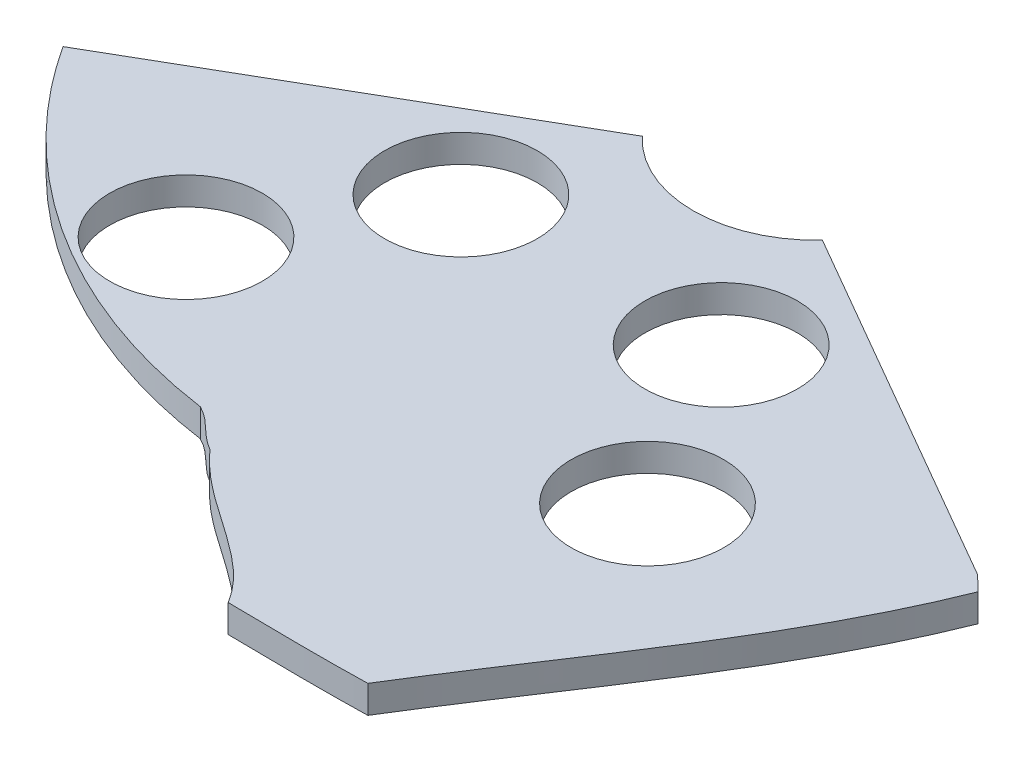
ISO-10303-21;
HEADER;
FILE_DESCRIPTION(('STEP AP214'),'2;1');
FILE_NAME('part.step','',(''),(''),'','','');
FILE_SCHEMA(('AUTOMOTIVE_DESIGN { 1 0 10303 214 1 1 1 1 }'));
ENDSEC;
DATA;
#1=APPLICATION_CONTEXT('core data for automotive mechanical design processes');
#2=APPLICATION_PROTOCOL_DEFINITION('international standard','automotive_design',2000,#1);
#3=PRODUCT_CONTEXT('',#1,'mechanical');
#4=PRODUCT('Part','Part','',(#3));
#5=PRODUCT_RELATED_PRODUCT_CATEGORY('part','',(#4));
#6=PRODUCT_DEFINITION_FORMATION('','',#4);
#7=PRODUCT_DEFINITION_CONTEXT('part definition',#1,'design');
#8=PRODUCT_DEFINITION('design','',#6,#7);
#9=PRODUCT_DEFINITION_SHAPE('','',#8);
#10=(LENGTH_UNIT() NAMED_UNIT(*) SI_UNIT(.MILLI.,.METRE.));
#11=(NAMED_UNIT(*) PLANE_ANGLE_UNIT() SI_UNIT($,.RADIAN.));
#12=(NAMED_UNIT(*) SI_UNIT($,.STERADIAN.) SOLID_ANGLE_UNIT());
#13=UNCERTAINTY_MEASURE_WITH_UNIT(LENGTH_MEASURE(1.E-05),#10,'distance_accuracy_value','');
#14=(GEOMETRIC_REPRESENTATION_CONTEXT(3) GLOBAL_UNCERTAINTY_ASSIGNED_CONTEXT((#13)) GLOBAL_UNIT_ASSIGNED_CONTEXT((#10,
#11,#12)) REPRESENTATION_CONTEXT('',''));
#15=CARTESIAN_POINT('',(0.,0.,0.));
#16=DIRECTION('',(0.,0.,1.));
#17=DIRECTION('',(1.,0.,0.));
#18=AXIS2_PLACEMENT_3D('',#15,#16,#17);
#19=CARTESIAN_POINT('',(-42.2829416875087,-63.7359999999999,66.1392837787392));
#20=DIRECTION('',(0.,-1.,0.));
#21=DIRECTION('',(0.,0.,-1.));
#22=AXIS2_PLACEMENT_3D('',#19,#20,#21);
#23=PLANE('',#22);
#24=CARTESIAN_POINT('',(18.75,-63.7359999999999,32.476));
#25=DIRECTION('',(0.,-1.,0.));
#26=DIRECTION('',(0.,0.,-1.));
#27=AXIS2_PLACEMENT_3D('',#24,#25,#26);
#28=CIRCLE('',#27,10.999845998306);
#29=CARTESIAN_POINT('',(18.75,-63.7359999999999,21.476154001694));
#30=VERTEX_POINT('',#29);
#31=EDGE_CURVE('E447',#30,#30,#28,.T.);
#32=ORIENTED_EDGE('',*,*,#31,.F.);
#33=EDGE_LOOP('',(#32));
#34=FACE_BOUND('',#33,.T.);
#35=CARTESIAN_POINT('',(-33.25,-63.7359999999999,57.591));
#36=DIRECTION('',(0.,-1.,0.));
#37=DIRECTION('',(0.,0.,-1.));
#38=AXIS2_PLACEMENT_3D('',#35,#36,#37);
#39=CIRCLE('',#38,10.999845998306);
#40=CARTESIAN_POINT('',(-33.25,-63.7359999999999,46.591154001694));
#41=VERTEX_POINT('',#40);
#42=EDGE_CURVE('E302',#41,#41,#39,.T.);
#43=ORIENTED_EDGE('',*,*,#42,.F.);
#44=EDGE_LOOP('',(#43));
#45=FACE_BOUND('',#44,.T.);
#46=CARTESIAN_POINT('',(-65.8942438215736,-63.7359999999999,42.6629141284689));
#47=CARTESIAN_POINT('',(-64.3740048179713,-63.7359999999999,45.0101337964769));
#48=CARTESIAN_POINT('',(-62.7293879267321,-63.7359999999999,47.2771326027146));
#49=CARTESIAN_POINT('',(-59.2082837714852,-63.7359999999999,51.6187172670186));
#50=CARTESIAN_POINT('',(-57.3302026715458,-63.7359999999999,53.6960570543909));
#51=CARTESIAN_POINT('',(-51.381584771103,-63.7359999999999,59.610638433358));
#52=CARTESIAN_POINT('',(-46.9944312695531,-63.7359999999999,63.1270068131331));
#53=CARTESIAN_POINT('',(-39.9271968964865,-63.7359999999999,67.6454222615422));
#54=CARTESIAN_POINT('',(-37.4916252366814,-63.7359999999999,69.0254847346516));
#55=CARTESIAN_POINT('',(-32.4863725547856,-63.7359999999999,71.5169507605835));
#56=CARTESIAN_POINT('',(-29.9155606858525,-63.7359999999999,72.6298302490515));
#57=CARTESIAN_POINT('',(-22.0525065809193,-63.7359999999999,75.5468810200134));
#58=CARTESIAN_POINT('',(-16.6005816491119,-63.7359999999999,76.9277313353586));
#59=CARTESIAN_POINT('',(-11.065103995336,-63.7359999999999,77.7159208735888));
#60=B_SPLINE_CURVE_WITH_KNOTS('',3,(#46,#47,#48,#49,#50,#51,#52,#53,#54,#55,#56,#57,#58,#59),
.UNSPECIFIED.,.F.,.F.,(4,2,2,2,2,2,4),(1.36573139508656E-06,0.125001365731395,0.250001365731395,
0.500001365731395,0.625001365731395,0.750001365731395,1.),.UNSPECIFIED.);
#61=CARTESIAN_POINT('',(-11.0651039947963,-63.7359999999999,77.7159208697998));
#62=VERTEX_POINT('',#61);
#63=CARTESIAN_POINT('',(-65.8942438215736,-63.7359999999999,42.6629141284689));
#64=VERTEX_POINT('',#63);
#65=EDGE_CURVE('E262',#62,#64,#60,.F.);
#66=ORIENTED_EDGE('',*,*,#65,.T.);
#67=DIRECTION('',(0.866025113443951,0.,-0.500000502884139));
#68=VECTOR('',#67,1.);
#69=CARTESIAN_POINT('',(-65.8942438215736,-63.7359999999999,42.6629141284689));
#70=LINE('',#69,#68);
#71=CARTESIAN_POINT('',(-12.9766531358799,-63.7359999999999,12.1108879302399));
#72=VERTEX_POINT('',#71);
#73=EDGE_CURVE('E105',#64,#72,#70,.T.);
#74=ORIENTED_EDGE('',*,*,#73,.T.);
#75=CARTESIAN_POINT('',(0.,-63.7359999999999,0.));
#76=DIRECTION('',(0.,1.,0.));
#77=DIRECTION('',(0.,0.,-1.));
#78=AXIS2_PLACEMENT_3D('',#75,#76,#77);
#79=CIRCLE('',#78,17.7501305084715);
#80=CARTESIAN_POINT('',(12.9766531358511,-63.7359999999999,12.1108879302707));
#81=VERTEX_POINT('',#80);
#82=EDGE_CURVE('E272',#72,#81,#79,.T.);
#83=ORIENTED_EDGE('',*,*,#82,.T.);
#84=DIRECTION('',(0.866025113442762,0.,0.500000502886197));
#85=VECTOR('',#84,1.);
#86=CARTESIAN_POINT('',(12.9766531358511,-63.7359999999999,12.1108879302707));
#87=LINE('',#86,#85);
#88=CARTESIAN_POINT('',(65.8946490574716,-63.7359999999999,42.6631480920527));
#89=VERTEX_POINT('',#88);
#90=EDGE_CURVE('E205',#81,#89,#87,.T.);
#91=ORIENTED_EDGE('',*,*,#90,.T.);
#92=CARTESIAN_POINT('',(65.8946490574716,-63.7359999999999,42.6631480920527));
#93=CARTESIAN_POINT('',(66.6334334765272,-63.7359999999999,43.3830753385999));
#94=CARTESIAN_POINT('',(67.3568134463881,-63.7359999999999,44.0873401028635));
#95=CARTESIAN_POINT('',(68.063045438667,-63.7359999999999,44.7780327601671));
#96=B_SPLINE_CURVE_WITH_KNOTS('',3,(#92,#93,#94,#95),.UNSPECIFIED.,.F.,.F.,(4,4),(0.,1.),.UNSPECIFIED.);
#97=CARTESIAN_POINT('',(68.0628306155719,-63.7359999999999,44.7778226639574));
#98=VERTEX_POINT('',#97);
#99=EDGE_CURVE('E200',#89,#98,#96,.T.);
#100=ORIENTED_EDGE('',*,*,#99,.T.);
#101=DIRECTION('',(0.144708564958756,0.,0.989474320650909));
#102=VECTOR('',#101,1.);
#103=CARTESIAN_POINT('',(68.0628306155777,-63.7359999999999,44.7778226639631));
#104=LINE('',#103,#102);
#105=CARTESIAN_POINT('',(68.0629249195197,-63.7359999999999,44.7784674863961));
#106=VERTEX_POINT('',#105);
#107=EDGE_CURVE('E195',#98,#106,#104,.T.);
#108=ORIENTED_EDGE('',*,*,#107,.T.);
#109=CARTESIAN_POINT('',(68.0630842305653,-63.7359999999999,44.7780706985244));
#110=CARTESIAN_POINT('',(67.9358904300877,-63.7359999999999,45.0948657910764));
#111=CARTESIAN_POINT('',(67.6810774563663,-63.7359999999999,45.7295154303705));
#112=CARTESIAN_POINT('',(67.2875254071985,-63.7359999999999,46.6787276797621));
#113=CARTESIAN_POINT('',(66.8850675095938,-63.7359999999999,47.627899562102));
#114=CARTESIAN_POINT('',(66.4730707587199,-63.7359999999999,48.5766877061698));
#115=CARTESIAN_POINT('',(66.0519024364325,-63.7359999999999,49.5251421250758));
#116=CARTESIAN_POINT('',(65.2305066151441,-63.7359999999999,51.3352691894795));
#117=CARTESIAN_POINT('',(63.9524963729421,-63.7359999999999,54.0180261178298));
#118=CARTESIAN_POINT('',(62.1418174699911,-63.7359999999999,57.5695661040901));
#119=CARTESIAN_POINT('',(60.3928513682514,-63.7359999999999,60.800227603283));
#120=CARTESIAN_POINT('',(58.7399300816313,-63.7359999999999,63.7201666531254));
#121=CARTESIAN_POINT('',(56.7244384823523,-63.7359999999999,67.1624735683248));
#122=CARTESIAN_POINT('',(54.1121934479651,-63.7359999999999,71.4316164958488));
#123=CARTESIAN_POINT('',(50.8890831288475,-63.7359999999999,76.4823168978045));
#124=CARTESIAN_POINT('',(48.1533843683959,-63.7359999999999,80.6613622151774));
#125=CARTESIAN_POINT('',(45.9541363050795,-63.7359999999999,83.9978481077662));
#126=CARTESIAN_POINT('',(43.7539014566178,-63.7359999999999,87.3336992875681));
#127=CARTESIAN_POINT('',(41.5335772396995,-63.7359999999999,90.7177029551642));
#128=CARTESIAN_POINT('',(39.3659080726172,-63.7359999999999,94.0747577948065));
#129=CARTESIAN_POINT('',(37.9023883164681,-63.7359999999999,96.3718065868322));
#130=CARTESIAN_POINT('',(36.6419641302257,-63.7359999999999,98.3725542166312));
#131=CARTESIAN_POINT('',(35.8946146759264,-63.7359999999999,99.5763480022166));
#132=CARTESIAN_POINT('',(35.5300000154372,-63.7359999999999,100.163651384731));
#133=B_SPLINE_CURVE_WITH_KNOTS('',3,(#109,#110,#111,#112,#113,#114,#115,#116,#117,#118,#119,
#120,#121,#122,#123,#124,#125,#126,#127,#128,#129,#130,#131,#132),.UNSPECIFIED.,.F.,.F.,(4,1,1,
1,1,1,1,1,1,1,1,1,1,1,1,1,1,1,1,1,1,4),(0.,0.0159170977809173,0.0318874269291693,
0.0479109001297367,0.0639873274975975,0.0801164459021321,0.0962976469485111,0.156669991679664,
0.218652105360708,0.28215410059159,0.327945602830221,0.375094202021531,0.468139327245125,
0.561286896444691,0.654447931444377,0.701029808346877,0.747611806634454,0.840773488069758,
0.889744139167359,0.933934125352742,0.967767974786288,1.),.UNSPECIFIED.);
#134=CARTESIAN_POINT('',(35.5300000154372,-63.7359999999999,100.163651384731));
#135=VERTEX_POINT('',#134);
#136=EDGE_CURVE('E187',#106,#135,#133,.T.);
#137=ORIENTED_EDGE('',*,*,#136,.T.);
#138=CARTESIAN_POINT('',(35.5300436758376,-63.7359999999999,100.163650263284));
#139=CARTESIAN_POINT('',(29.2268660007023,-63.7359999999999,100.325552183145));
#140=CARTESIAN_POINT('',(22.469638628282,-63.7359999999999,100.239307551905));
#141=CARTESIAN_POINT('',(15.3839405395206,-63.7359999999999,100.141444272619));
#142=B_SPLINE_CURVE_WITH_KNOTS('',3,(#138,#139,#140,#141),.UNSPECIFIED.,.F.,.F.,(4,4),(0.,1.),.UNSPECIFIED.);
#143=CARTESIAN_POINT('',(15.3839902680413,-63.7359999999999,100.141444959438));
#144=VERTEX_POINT('',#143);
#145=EDGE_CURVE('E133',#135,#144,#142,.T.);
#146=ORIENTED_EDGE('',*,*,#145,.T.);
#147=DIRECTION('',(-0.871038708722197,0.,-0.491214380802892));
#148=VECTOR('',#147,1.);
#149=CARTESIAN_POINT('',(15.3838758739003,-63.7359999999999,100.1413804479));
#150=LINE('',#149,#148);
#151=CARTESIAN_POINT('',(15.3838758739003,-63.7359999999999,100.1413804479));
#152=VERTEX_POINT('',#151);
#153=EDGE_CURVE('E127',#144,#152,#150,.T.);
#154=ORIENTED_EDGE('',*,*,#153,.T.);
#155=CARTESIAN_POINT('',(1725.43514180767,-63.7359999999999,-936.568937926172));
#156=CARTESIAN_POINT('',(12.8992621495731,-63.7359999999999,134.980015198384));
#157=CARTESIAN_POINT('',(22.9361598386133,-63.7359999999999,111.54339704118));
#158=CARTESIAN_POINT('',(14.9165620183736,-63.7359999999999,99.4110977344802));
#159=CARTESIAN_POINT('',(14.6687666726495,-63.7359999999999,99.0533062474783));
#160=CARTESIAN_POINT('',(14.2757116594221,-63.7359999999999,98.51346966157));
#161=CARTESIAN_POINT('',(13.7103705141985,-63.7359999999999,97.8006333126932));
#162=CARTESIAN_POINT('',(12.9538427121503,-63.7359999999999,96.9496299765793));
#163=CARTESIAN_POINT('',(12.1457493520841,-63.7359999999999,96.1290286107687));
#164=CARTESIAN_POINT('',(11.0481647809802,-63.7359999999999,95.1096639910754));
#165=CARTESIAN_POINT('',(9.56076850723573,-63.7359999999999,93.8743809869654));
#166=CARTESIAN_POINT('',(7.70697702751642,-63.7359999999999,92.4865167672325));
#167=CARTESIAN_POINT('',(5.77924977557135,-63.7359999999999,91.1311940775951));
#168=CARTESIAN_POINT('',(3.86767650580928,-63.7359999999999,89.8153595867252));
#169=CARTESIAN_POINT('',(2.389743011692,-63.7359999999999,88.7790728261374));
#170=CARTESIAN_POINT('',(1.13978805334641,-63.7359999999999,87.8699716698412));
#171=CARTESIAN_POINT('',(-0.0940102151995004,-63.7359999999999,86.9427694793467));
#172=CARTESIAN_POINT('',(-1.69570890195131,-63.7359999999999,85.6498868092487));
#173=CARTESIAN_POINT('',(-3.41700053521723,-63.7359999999999,84.0938623514197));
#174=CARTESIAN_POINT('',(-11.0989746422448,-63.7359999999999,76.1193910719865));
#175=CARTESIAN_POINT('',(-13.8979113895041,-63.7359999999999,64.907370266258));
#176=CARTESIAN_POINT('',(-1530.29165615687,-63.7359999999999,1375.8144548702));
#177=B_SPLINE_CURVE_WITH_KNOTS('',3,(#155,#156,#157,#158,#159,#160,#161,#162,#163,#164,#165,
#166,#167,#168,#169,#170,#171,#172,#173,#174,#175,#176),.UNSPECIFIED.,.F.,.F.,(4,1,1,1,1,1,1,1,
1,1,1,1,1,1,1,1,1,1,1,4),(-1.55283801800835,0.015882206536648,0.0317990199924308,
0.0477623685485549,0.0637846514167076,0.105296803450609,0.147845775029889,0.189059457133469,
0.232020265553993,0.312680156924747,0.401736234529398,0.48685859606086,0.572050918122516,
0.657183823147968,0.685531808160438,0.742176031089383,0.82705360272294,0.912010016950205,
0.997436368194864,2.04441067172463),.UNSPECIFIED.);
#178=CARTESIAN_POINT('',(-5.05286488906826,-63.7359999999999,82.3440896998141));
#179=VERTEX_POINT('',#178);
#180=EDGE_CURVE('E131',#152,#179,#177,.T.);
#181=ORIENTED_EDGE('',*,*,#180,.T.);
#182=CARTESIAN_POINT('',(-11.0651039947963,-63.7359999999999,77.7159208697998));
#183=CARTESIAN_POINT('',(-10.9978672632964,-63.7359999999999,77.7504720981919));
#184=CARTESIAN_POINT('',(-10.8700519591634,-63.7359999999999,77.8161530982436));
#185=CARTESIAN_POINT('',(-10.6027402677977,-63.7359999999999,77.9622232721413));
#186=CARTESIAN_POINT('',(-10.1295905812633,-63.7359999999999,78.2415643226457));
#187=CARTESIAN_POINT('',(-9.46952802728936,-63.7359999999999,78.6988505018676));
#188=CARTESIAN_POINT('',(-8.72777210449937,-63.7359999999999,79.3139153221342));
#189=CARTESIAN_POINT('',(-8.13938495290766,-63.7359999999999,79.8616346829339));
#190=CARTESIAN_POINT('',(-7.67225235677613,-63.7359999999999,80.3054924169038));
#191=CARTESIAN_POINT('',(-7.20244873436876,-63.7359999999999,80.7472805818999));
#192=CARTESIAN_POINT('',(-6.60148240379559,-63.7359999999999,81.2841689110431));
#193=CARTESIAN_POINT('',(-5.96212202317357,-63.7359999999999,81.77530563453));
#194=CARTESIAN_POINT('',(-5.50206261472947,-63.7359999999999,82.0780103897965));
#195=CARTESIAN_POINT('',(-5.24240329265239,-63.736,82.2358682961159));
#196=CARTESIAN_POINT('',(-5.11815836000572,-63.7359999999999,82.3068096612052));
#197=CARTESIAN_POINT('',(-5.05286488906807,-63.7359999999999,82.3440896998138));
#198=B_SPLINE_CURVE_WITH_KNOTS('',3,(#182,#183,#184,#185,#186,#187,#188,#189,#190,#191,#192,
#193,#194,#195,#196,#197),.UNSPECIFIED.,.F.,.F.,(4,1,1,1,1,1,1,1,1,1,1,1,1,4),
(2.90813879177954E-05,0.0298132024932265,0.0566479326093307,0.120041645002526,0.246231838150585,
0.372528008338328,0.499375491326203,0.562902954118511,0.626425197110847,0.753476239273777,
0.88028036137663,0.943630545235836,0.970376843838159,1.),.UNSPECIFIED.);
#199=EDGE_CURVE('E51',#179,#62,#198,.F.);
#200=ORIENTED_EDGE('',*,*,#199,.T.);
#201=EDGE_LOOP('',(#66,#74,#83,#91,#100,#108,#137,#146,#154,#181,#200));
#202=FACE_BOUND('',#201,.T.);
#203=CARTESIAN_POINT('',(33.25,-63.7359999999999,57.591));
#204=DIRECTION('',(0.,-1.,0.));
#205=DIRECTION('',(0.,0.,-1.));
#206=AXIS2_PLACEMENT_3D('',#203,#204,#205);
#207=CIRCLE('',#206,10.999845998306);
#208=CARTESIAN_POINT('',(33.25,-63.7359999999999,46.591154001694));
#209=VERTEX_POINT('',#208);
#210=EDGE_CURVE('E309',#209,#209,#207,.T.);
#211=ORIENTED_EDGE('',*,*,#210,.F.);
#212=EDGE_LOOP('',(#211));
#213=FACE_BOUND('',#212,.T.);
#214=CARTESIAN_POINT('',(-18.75,-63.7359999999999,32.476));
#215=DIRECTION('',(0.,-1.,0.));
#216=DIRECTION('',(0.,0.,-1.));
#217=AXIS2_PLACEMENT_3D('',#214,#215,#216);
#218=CIRCLE('',#217,10.999845998306);
#219=CARTESIAN_POINT('',(-18.75,-63.7359999999999,21.476154001694));
#220=VERTEX_POINT('',#219);
#221=EDGE_CURVE('E438',#220,#220,#218,.T.);
#222=ORIENTED_EDGE('',*,*,#221,.F.);
#223=EDGE_LOOP('',(#222));
#224=FACE_BOUND('',#223,.T.);
#225=ADVANCED_FACE('F30',(#34,#45,#202,#213,#224),#23,.T.);
#226=CARTESIAN_POINT('',(-42.2829416875087,-59.7359999999999,66.1392837787392));
#227=DIRECTION('',(0.,-1.,0.));
#228=DIRECTION('',(0.,0.,-1.));
#229=AXIS2_PLACEMENT_3D('',#226,#227,#228);
#230=PLANE('',#229);
#231=CARTESIAN_POINT('',(18.75,-59.7359999999999,32.476));
#232=DIRECTION('',(0.,-1.,0.));
#233=DIRECTION('',(0.,0.,-1.));
#234=AXIS2_PLACEMENT_3D('',#231,#232,#233);
#235=CIRCLE('',#234,10.999845998306);
#236=CARTESIAN_POINT('',(18.75,-59.7359999999999,21.476154001694));
#237=VERTEX_POINT('',#236);
#238=EDGE_CURVE('E444',#237,#237,#235,.T.);
#239=ORIENTED_EDGE('',*,*,#238,.T.);
#240=EDGE_LOOP('',(#239));
#241=FACE_BOUND('',#240,.T.);
#242=CARTESIAN_POINT('',(-33.25,-59.7359999999999,57.591));
#243=DIRECTION('',(0.,-1.,0.));
#244=DIRECTION('',(0.,0.,-1.));
#245=AXIS2_PLACEMENT_3D('',#242,#243,#244);
#246=CIRCLE('',#245,10.999845998306);
#247=CARTESIAN_POINT('',(-33.25,-59.7359999999999,46.591154001694));
#248=VERTEX_POINT('',#247);
#249=EDGE_CURVE('E304',#248,#248,#246,.T.);
#250=ORIENTED_EDGE('',*,*,#249,.T.);
#251=EDGE_LOOP('',(#250));
#252=FACE_BOUND('',#251,.T.);
#253=CARTESIAN_POINT('',(-11.065103995336,-59.7359999999999,77.7159208735888));
#254=CARTESIAN_POINT('',(-16.6005816491119,-59.7359999999999,76.9277313353586));
#255=CARTESIAN_POINT('',(-22.0525065809193,-59.7359999999999,75.5468810200134));
#256=CARTESIAN_POINT('',(-29.9155606858525,-59.7359999999999,72.6298302490515));
#257=CARTESIAN_POINT('',(-32.4863725547856,-59.7359999999999,71.5169507605835));
#258=CARTESIAN_POINT('',(-37.4916252366814,-59.7359999999999,69.0254847346516));
#259=CARTESIAN_POINT('',(-39.9271968964865,-59.7359999999999,67.6454222615422));
#260=CARTESIAN_POINT('',(-46.9944312695531,-59.7359999999999,63.1270068131331));
#261=CARTESIAN_POINT('',(-51.381584771103,-59.7359999999999,59.610638433358));
#262=CARTESIAN_POINT('',(-57.3302026715458,-59.7359999999999,53.6960570543909));
#263=CARTESIAN_POINT('',(-59.2082837714852,-59.7359999999999,51.6187172670186));
#264=CARTESIAN_POINT('',(-62.7293879267321,-59.7359999999999,47.2771326027146));
#265=CARTESIAN_POINT('',(-64.3740048179713,-59.7359999999999,45.0101337964769));
#266=CARTESIAN_POINT('',(-65.8942438215736,-59.7359999999999,42.6629141284689));
#267=B_SPLINE_CURVE_WITH_KNOTS('',3,(#253,#254,#255,#256,#257,#258,#259,#260,#261,#262,#263,
#264,#265,#266),.UNSPECIFIED.,.F.,.F.,(4,2,2,2,2,2,4),(1.36573139501937E-06,0.25,0.375,0.5,0.75,
0.875,1.),.UNSPECIFIED.);
#268=CARTESIAN_POINT('',(-11.0651039947963,-59.7359999999999,77.7159208697998));
#269=VERTEX_POINT('',#268);
#270=CARTESIAN_POINT('',(-65.8942438215736,-59.7359999999999,42.6629141284689));
#271=VERTEX_POINT('',#270);
#272=EDGE_CURVE('E280',#269,#271,#267,.T.);
#273=ORIENTED_EDGE('',*,*,#272,.F.);
#274=CARTESIAN_POINT('',(-5.05286488906807,-59.7359999999999,82.3440896998138));
#275=CARTESIAN_POINT('',(-5.11815836000572,-59.7359999999999,82.3068096612052));
#276=CARTESIAN_POINT('',(-5.24240329265239,-59.736,82.2358682961159));
#277=CARTESIAN_POINT('',(-5.50206261472947,-59.7359999999999,82.0780103897965));
#278=CARTESIAN_POINT('',(-5.96212202317357,-59.7359999999999,81.77530563453));
#279=CARTESIAN_POINT('',(-6.60148240379559,-59.7359999999999,81.2841689110431));
#280=CARTESIAN_POINT('',(-7.20244873436876,-59.7359999999999,80.7472805818999));
#281=CARTESIAN_POINT('',(-7.67225235677613,-59.7359999999999,80.3054924169038));
#282=CARTESIAN_POINT('',(-8.13938495290766,-59.7359999999999,79.8616346829339));
#283=CARTESIAN_POINT('',(-8.72777210449937,-59.7359999999999,79.3139153221342));
#284=CARTESIAN_POINT('',(-9.46952802728936,-59.7359999999999,78.6988505018676));
#285=CARTESIAN_POINT('',(-10.1295905812633,-59.7359999999999,78.2415643226457));
#286=CARTESIAN_POINT('',(-10.6027402677977,-59.7359999999999,77.9622232721413));
#287=CARTESIAN_POINT('',(-10.8700519591634,-59.7359999999999,77.8161530982436));
#288=CARTESIAN_POINT('',(-10.9978672632964,-59.7359999999999,77.7504720981919));
#289=CARTESIAN_POINT('',(-11.0651039947963,-59.7359999999999,77.7159208697998));
#290=B_SPLINE_CURVE_WITH_KNOTS('',3,(#274,#275,#276,#277,#278,#279,#280,#281,#282,#283,#284,
#285,#286,#287,#288,#289),.UNSPECIFIED.,.F.,.F.,(4,1,1,1,1,1,1,1,1,1,1,1,1,4),
(2.90813879178488E-05,0.0296522375497585,0.0563985361520822,0.119748720011287,0.246552842114141,
0.373603884277071,0.437126127269407,0.500653590061714,0.62750107304959,0.753797243237333,
0.879987436385392,0.943381148778587,0.970215878894691,1.),.UNSPECIFIED.);
#291=CARTESIAN_POINT('',(-5.05286488906826,-59.7359999999999,82.3440896998141));
#292=VERTEX_POINT('',#291);
#293=EDGE_CURVE('E96',#292,#269,#290,.T.);
#294=ORIENTED_EDGE('',*,*,#293,.F.);
#295=CARTESIAN_POINT('',(1725.43514180767,-59.7359999999999,-936.568937926172));
#296=CARTESIAN_POINT('',(12.8992621495731,-59.7359999999999,134.980015198384));
#297=CARTESIAN_POINT('',(22.9361598386133,-59.7359999999999,111.54339704118));
#298=CARTESIAN_POINT('',(14.9165620183736,-59.7359999999999,99.4110977344802));
#299=CARTESIAN_POINT('',(14.6687666726495,-59.7359999999999,99.0533062474783));
#300=CARTESIAN_POINT('',(14.2757116594221,-59.7359999999999,98.51346966157));
#301=CARTESIAN_POINT('',(13.7103705141985,-59.7359999999999,97.8006333126932));
#302=CARTESIAN_POINT('',(12.9538427121503,-59.7359999999999,96.9496299765793));
#303=CARTESIAN_POINT('',(12.1457493520841,-59.7359999999999,96.1290286107687));
#304=CARTESIAN_POINT('',(11.0481647809802,-59.7359999999999,95.1096639910754));
#305=CARTESIAN_POINT('',(9.56076850723573,-59.7359999999999,93.8743809869654));
#306=CARTESIAN_POINT('',(7.70697702751642,-59.7359999999999,92.4865167672325));
#307=CARTESIAN_POINT('',(5.77924977557135,-59.7359999999999,91.1311940775951));
#308=CARTESIAN_POINT('',(3.86767650580928,-59.7359999999999,89.8153595867252));
#309=CARTESIAN_POINT('',(2.389743011692,-59.7359999999999,88.7790728261374));
#310=CARTESIAN_POINT('',(1.13978805334641,-59.7359999999999,87.8699716698412));
#311=CARTESIAN_POINT('',(-0.0940102151995004,-59.7359999999999,86.9427694793467));
#312=CARTESIAN_POINT('',(-1.69570890195131,-59.7359999999999,85.6498868092487));
#313=CARTESIAN_POINT('',(-3.41700053521723,-59.7359999999999,84.0938623514197));
#314=CARTESIAN_POINT('',(-11.0989746422448,-59.7359999999999,76.1193910719865));
#315=CARTESIAN_POINT('',(-13.8979113895041,-59.7359999999999,64.907370266258));
#316=CARTESIAN_POINT('',(-1530.29165615687,-59.7359999999999,1375.8144548702));
#317=B_SPLINE_CURVE_WITH_KNOTS('',3,(#295,#296,#297,#298,#299,#300,#301,#302,#303,#304,#305,
#306,#307,#308,#309,#310,#311,#312,#313,#314,#315,#316),.UNSPECIFIED.,.F.,.F.,(4,1,1,1,1,1,1,1,
1,1,1,1,1,1,1,1,1,1,1,4),(-1.55283801800835,0.015882206536648,0.0317990199924308,
0.0477623685485549,0.0637846514167076,0.105296803450609,0.147845775029889,0.189059457133469,
0.232020265553993,0.312680156924747,0.401736234529398,0.48685859606086,0.572050918122516,
0.657183823147968,0.685531808160438,0.742176031089383,0.82705360272294,0.912010016950205,
0.997436368194864,2.04441067172463),.UNSPECIFIED.);
#318=CARTESIAN_POINT('',(15.3838758739003,-59.7359999999999,100.1413804479));
#319=VERTEX_POINT('',#318);
#320=EDGE_CURVE('E90',#319,#292,#317,.T.);
#321=ORIENTED_EDGE('',*,*,#320,.F.);
#322=DIRECTION('',(-0.871038708722197,0.,-0.491214380802892));
#323=VECTOR('',#322,1.);
#324=CARTESIAN_POINT('',(15.3838758739003,-59.7359999999999,100.1413804479));
#325=LINE('',#324,#323);
#326=CARTESIAN_POINT('',(15.3839902680413,-59.7359999999999,100.141444959438));
#327=VERTEX_POINT('',#326);
#328=EDGE_CURVE('E141',#327,#319,#325,.T.);
#329=ORIENTED_EDGE('',*,*,#328,.F.);
#330=CARTESIAN_POINT('',(35.5300436758376,-59.7359999999999,100.163650263284));
#331=CARTESIAN_POINT('',(29.2268660007023,-59.7359999999999,100.325552183145));
#332=CARTESIAN_POINT('',(22.469638628282,-59.7359999999999,100.239307551905));
#333=CARTESIAN_POINT('',(15.3839405395206,-59.7359999999999,100.141444272619));
#334=B_SPLINE_CURVE_WITH_KNOTS('',3,(#330,#331,#332,#333),.UNSPECIFIED.,.F.,.F.,(4,4),(0.,1.),.UNSPECIFIED.);
#335=CARTESIAN_POINT('',(35.5300000154372,-59.7359999999999,100.163651384731));
#336=VERTEX_POINT('',#335);
#337=EDGE_CURVE('E352',#336,#327,#334,.T.);
#338=ORIENTED_EDGE('',*,*,#337,.F.);
#339=CARTESIAN_POINT('',(68.0630842305653,-59.7359999999999,44.7780706985244));
#340=CARTESIAN_POINT('',(67.9358904300877,-59.7359999999999,45.0948657910764));
#341=CARTESIAN_POINT('',(67.6810774563663,-59.7359999999999,45.7295154303705));
#342=CARTESIAN_POINT('',(67.2875254071985,-59.7359999999999,46.6787276797621));
#343=CARTESIAN_POINT('',(66.8850675095938,-59.7359999999999,47.627899562102));
#344=CARTESIAN_POINT('',(66.4730707587199,-59.7359999999999,48.5766877061698));
#345=CARTESIAN_POINT('',(66.0519024364325,-59.7359999999999,49.5251421250758));
#346=CARTESIAN_POINT('',(65.2305066151441,-59.7359999999999,51.3352691894795));
#347=CARTESIAN_POINT('',(63.9524963729421,-59.7359999999999,54.0180261178298));
#348=CARTESIAN_POINT('',(62.1418174699911,-59.7359999999999,57.5695661040901));
#349=CARTESIAN_POINT('',(60.3928513682514,-59.7359999999999,60.800227603283));
#350=CARTESIAN_POINT('',(58.7399300816313,-59.7359999999999,63.7201666531254));
#351=CARTESIAN_POINT('',(56.7244384823523,-59.7359999999999,67.1624735683248));
#352=CARTESIAN_POINT('',(54.1121934479651,-59.7359999999999,71.4316164958488));
#353=CARTESIAN_POINT('',(50.8890831288475,-59.7359999999999,76.4823168978045));
#354=CARTESIAN_POINT('',(48.1533843683959,-59.7359999999999,80.6613622151774));
#355=CARTESIAN_POINT('',(45.9541363050795,-59.7359999999999,83.9978481077662));
#356=CARTESIAN_POINT('',(43.7539014566178,-59.7359999999999,87.3336992875681));
#357=CARTESIAN_POINT('',(41.5335772396995,-59.7359999999999,90.7177029551642));
#358=CARTESIAN_POINT('',(39.3659080726172,-59.7359999999999,94.0747577948065));
#359=CARTESIAN_POINT('',(37.9023883164681,-59.7359999999999,96.3718065868322));
#360=CARTESIAN_POINT('',(36.6419641302257,-59.7359999999999,98.3725542166312));
#361=CARTESIAN_POINT('',(35.8946146759264,-59.7359999999999,99.5763480022166));
#362=CARTESIAN_POINT('',(35.5300000154372,-59.7359999999999,100.163651384731));
#363=B_SPLINE_CURVE_WITH_KNOTS('',3,(#339,#340,#341,#342,#343,#344,#345,#346,#347,#348,#349,
#350,#351,#352,#353,#354,#355,#356,#357,#358,#359,#360,#361,#362),.UNSPECIFIED.,.F.,.F.,(4,1,1,
1,1,1,1,1,1,1,1,1,1,1,1,1,1,1,1,1,1,4),(0.,0.0159170977809173,0.0318874269291693,
0.0479109001297367,0.0639873274975975,0.0801164459021321,0.0962976469485111,0.156669991679664,
0.218652105360708,0.28215410059159,0.327945602830221,0.375094202021531,0.468139327245125,
0.561286896444691,0.654447931444377,0.701029808346877,0.747611806634454,0.840773488069758,
0.889744139167359,0.933934125352742,0.967767974786288,1.),.UNSPECIFIED.);
#364=CARTESIAN_POINT('',(68.0629249195197,-59.7359999999999,44.7784674863961));
#365=VERTEX_POINT('',#364);
#366=EDGE_CURVE('E349',#365,#336,#363,.T.);
#367=ORIENTED_EDGE('',*,*,#366,.F.);
#368=DIRECTION('',(0.144708564958756,0.,0.989474320650909));
#369=VECTOR('',#368,1.);
#370=CARTESIAN_POINT('',(68.0628306155777,-59.7359999999999,44.7778226639631));
#371=LINE('',#370,#369);
#372=CARTESIAN_POINT('',(68.0628306155719,-59.7359999999999,44.7778226639574));
#373=VERTEX_POINT('',#372);
#374=EDGE_CURVE('E361',#373,#365,#371,.T.);
#375=ORIENTED_EDGE('',*,*,#374,.F.);
#376=CARTESIAN_POINT('',(65.8946490574716,-59.7359999999999,42.6631480920527));
#377=CARTESIAN_POINT('',(66.6334334765272,-59.7359999999999,43.3830753385999));
#378=CARTESIAN_POINT('',(67.3568134463881,-59.7359999999999,44.0873401028635));
#379=CARTESIAN_POINT('',(68.063045438667,-59.7359999999999,44.7780327601671));
#380=B_SPLINE_CURVE_WITH_KNOTS('',3,(#376,#377,#378,#379),.UNSPECIFIED.,.F.,.F.,(4,4),(0.,1.),.UNSPECIFIED.);
#381=CARTESIAN_POINT('',(65.8946490574716,-59.7359999999999,42.6631480920527));
#382=VERTEX_POINT('',#381);
#383=EDGE_CURVE('E336',#382,#373,#380,.T.);
#384=ORIENTED_EDGE('',*,*,#383,.F.);
#385=DIRECTION('',(0.866025113442762,0.,0.500000502886197));
#386=VECTOR('',#385,1.);
#387=CARTESIAN_POINT('',(12.9766531358511,-59.7359999999999,12.1108879302707));
#388=LINE('',#387,#386);
#389=CARTESIAN_POINT('',(12.9766531358511,-59.7359999999999,12.1108879302707));
#390=VERTEX_POINT('',#389);
#391=EDGE_CURVE('E301',#390,#382,#388,.T.);
#392=ORIENTED_EDGE('',*,*,#391,.F.);
#393=CARTESIAN_POINT('',(0.,-59.7359999999999,0.));
#394=DIRECTION('',(0.,1.,0.));
#395=DIRECTION('',(0.,0.,-1.));
#396=AXIS2_PLACEMENT_3D('',#393,#394,#395);
#397=CIRCLE('',#396,17.7501305084715);
#398=CARTESIAN_POINT('',(-12.9766531358799,-59.7359999999999,12.1108879302399));
#399=VERTEX_POINT('',#398);
#400=EDGE_CURVE('E299',#399,#390,#397,.T.);
#401=ORIENTED_EDGE('',*,*,#400,.F.);
#402=DIRECTION('',(0.866025113443951,0.,-0.500000502884139));
#403=VECTOR('',#402,1.);
#404=CARTESIAN_POINT('',(-65.8942438215736,-59.7359999999999,42.6629141284689));
#405=LINE('',#404,#403);
#406=EDGE_CURVE('E293',#271,#399,#405,.T.);
#407=ORIENTED_EDGE('',*,*,#406,.F.);
#408=EDGE_LOOP('',(#273,#294,#321,#329,#338,#367,#375,#384,#392,#401,#407));
#409=FACE_BOUND('',#408,.T.);
#410=CARTESIAN_POINT('',(33.25,-59.7359999999999,57.591));
#411=DIRECTION('',(0.,-1.,0.));
#412=DIRECTION('',(0.,0.,-1.));
#413=AXIS2_PLACEMENT_3D('',#410,#411,#412);
#414=CIRCLE('',#413,10.999845998306);
#415=CARTESIAN_POINT('',(33.25,-59.7359999999999,46.591154001694));
#416=VERTEX_POINT('',#415);
#417=EDGE_CURVE('E312',#416,#416,#414,.T.);
#418=ORIENTED_EDGE('',*,*,#417,.T.);
#419=EDGE_LOOP('',(#418));
#420=FACE_BOUND('',#419,.T.);
#421=CARTESIAN_POINT('',(-18.75,-59.7359999999999,32.476));
#422=DIRECTION('',(0.,-1.,0.));
#423=DIRECTION('',(0.,0.,-1.));
#424=AXIS2_PLACEMENT_3D('',#421,#422,#423);
#425=CIRCLE('',#424,10.999845998306);
#426=CARTESIAN_POINT('',(-18.75,-59.7359999999999,21.476154001694));
#427=VERTEX_POINT('',#426);
#428=EDGE_CURVE('E441',#427,#427,#425,.T.);
#429=ORIENTED_EDGE('',*,*,#428,.T.);
#430=EDGE_LOOP('',(#429));
#431=FACE_BOUND('',#430,.T.);
#432=ADVANCED_FACE('F228',(#241,#252,#409,#420,#431),#230,.F.);
#433=CARTESIAN_POINT('',(-11.0650132751255,-63.7359999999999,77.7159337910687));
#434=CARTESIAN_POINT('',(-16.6005220818598,-63.7359999999999,76.9277464223892));
#435=CARTESIAN_POINT('',(-22.0524779439621,-63.7359999999999,75.5468916438062));
#436=CARTESIAN_POINT('',(-29.9155606858525,-63.7359999999999,72.6298302490515));
#437=CARTESIAN_POINT('',(-32.4863725547856,-63.7359999999999,71.5169507605835));
#438=CARTESIAN_POINT('',(-37.4916252366814,-63.7359999999999,69.0254847346516));
#439=CARTESIAN_POINT('',(-39.9271968964865,-63.7359999999999,67.6454222615422));
#440=CARTESIAN_POINT('',(-46.9944312695531,-63.7359999999999,63.1270068131331));
#441=CARTESIAN_POINT('',(-51.381584771103,-63.7359999999999,59.610638433358));
#442=CARTESIAN_POINT('',(-57.3302026715458,-63.7359999999999,53.6960570543909));
#443=CARTESIAN_POINT('',(-59.2082837714852,-63.7359999999999,51.6187172670186));
#444=CARTESIAN_POINT('',(-62.7293879267321,-63.7359999999999,47.2771326027146));
#445=CARTESIAN_POINT('',(-64.3740048179713,-63.7359999999999,45.0101337964769));
#446=CARTESIAN_POINT('',(-65.8942438215736,-63.7359999999999,42.6629141284689));
#447=B_SPLINE_CURVE_WITH_KNOTS('',3,(#433,#434,#435,#436,#437,#438,#439,#440,#441,#442,#443,
#444,#445,#446),.UNSPECIFIED.,.F.,.F.,(4,2,2,2,2,2,4),(0.,0.25,0.375,0.5,0.75,0.875,1.),.UNSPECIFIED.);
#448=DIRECTION('',(0.,1.,0.));
#449=VECTOR('',#448,1.);
#450=SURFACE_OF_LINEAR_EXTRUSION('',#447,#449);
#451=ORIENTED_EDGE('',*,*,#272,.T.);
#452=DIRECTION('',(0.,1.,0.));
#453=VECTOR('',#452,1.);
#454=CARTESIAN_POINT('',(-65.8942438215736,-63.7359999999999,42.6629141284689));
#455=LINE('',#454,#453);
#456=EDGE_CURVE('E11',#64,#271,#455,.T.);
#457=ORIENTED_EDGE('',*,*,#456,.F.);
#458=ORIENTED_EDGE('',*,*,#65,.F.);
#459=DIRECTION('',(0.,1.,0.));
#460=VECTOR('',#459,1.);
#461=CARTESIAN_POINT('',(-11.0651039947963,-63.7359999999999,77.7159208697998));
#462=LINE('',#461,#460);
#463=EDGE_CURVE('E147',#62,#269,#462,.T.);
#464=ORIENTED_EDGE('',*,*,#463,.T.);
#465=EDGE_LOOP('',(#451,#457,#458,#464));
#466=FACE_BOUND('',#465,.T.);
#467=ADVANCED_FACE('F32',(#466),#450,.F.);
#468=CARTESIAN_POINT('',(-65.8942438215736,-63.7359999999999,42.6629141284689));
#469=DIRECTION('',(0.500000502884139,0.,0.866025113443951));
#470=DIRECTION('',(0.866025113443951,0.,-0.500000502884139));
#471=AXIS2_PLACEMENT_3D('',#468,#469,#470);
#472=PLANE('',#471);
#473=ORIENTED_EDGE('',*,*,#406,.T.);
#474=DIRECTION('',(0.,1.,0.));
#475=VECTOR('',#474,1.);
#476=CARTESIAN_POINT('',(-12.9766531358799,-63.7359999999999,12.1108879302399));
#477=LINE('',#476,#475);
#478=EDGE_CURVE('E42',#72,#399,#477,.T.);
#479=ORIENTED_EDGE('',*,*,#478,.F.);
#480=ORIENTED_EDGE('',*,*,#73,.F.);
#481=ORIENTED_EDGE('',*,*,#456,.T.);
#482=EDGE_LOOP('',(#473,#479,#480,#481));
#483=FACE_BOUND('',#482,.T.);
#484=ADVANCED_FACE('F222',(#483),#472,.F.);
#485=CARTESIAN_POINT('',(0.,-63.7359999999999,0.));
#486=DIRECTION('',(0.,1.,0.));
#487=DIRECTION('',(0.,0.,1.));
#488=AXIS2_PLACEMENT_3D('',#485,#486,#487);
#489=CYLINDRICAL_SURFACE('',#488,17.7501305084715);
#490=ORIENTED_EDGE('',*,*,#400,.T.);
#491=DIRECTION('',(0.,1.,0.));
#492=VECTOR('',#491,1.);
#493=CARTESIAN_POINT('',(12.9766531358511,-63.7359999999999,12.1108879302707));
#494=LINE('',#493,#492);
#495=EDGE_CURVE('E331',#81,#390,#494,.T.);
#496=ORIENTED_EDGE('',*,*,#495,.F.);
#497=ORIENTED_EDGE('',*,*,#82,.F.);
#498=ORIENTED_EDGE('',*,*,#478,.T.);
#499=EDGE_LOOP('',(#490,#496,#497,#498));
#500=FACE_BOUND('',#499,.T.);
#501=ADVANCED_FACE('F219',(#500),#489,.F.);
#502=CARTESIAN_POINT('',(12.9766531358511,-63.7359999999999,12.1108879302707));
#503=DIRECTION('',(-0.500000502886197,0.,0.866025113442762));
#504=DIRECTION('',(0.866025113442762,0.,0.500000502886197));
#505=AXIS2_PLACEMENT_3D('',#502,#503,#504);
#506=PLANE('',#505);
#507=ORIENTED_EDGE('',*,*,#391,.T.);
#508=DIRECTION('',(0.,1.,0.));
#509=VECTOR('',#508,1.);
#510=CARTESIAN_POINT('',(65.8946490574716,-63.7359999999999,42.6631480920527));
#511=LINE('',#510,#509);
#512=EDGE_CURVE('E328',#89,#382,#511,.T.);
#513=ORIENTED_EDGE('',*,*,#512,.F.);
#514=ORIENTED_EDGE('',*,*,#90,.F.);
#515=ORIENTED_EDGE('',*,*,#495,.T.);
#516=EDGE_LOOP('',(#507,#513,#514,#515));
#517=FACE_BOUND('',#516,.T.);
#518=ADVANCED_FACE('F215',(#517),#506,.F.);
#519=DIRECTION('',(0.,1.,0.));
#520=VECTOR('',#519,1.);
#521=SURFACE_OF_LINEAR_EXTRUSION('',#96,#520);
#522=ORIENTED_EDGE('',*,*,#383,.T.);
#523=DIRECTION('',(0.,1.,0.));
#524=VECTOR('',#523,1.);
#525=CARTESIAN_POINT('',(68.0628306155719,-63.7359999999999,44.7778226639574));
#526=LINE('',#525,#524);
#527=EDGE_CURVE('E332',#98,#373,#526,.T.);
#528=ORIENTED_EDGE('',*,*,#527,.F.);
#529=ORIENTED_EDGE('',*,*,#99,.F.);
#530=ORIENTED_EDGE('',*,*,#512,.T.);
#531=EDGE_LOOP('',(#522,#528,#529,#530));
#532=FACE_BOUND('',#531,.T.);
#533=ADVANCED_FACE('F211',(#532),#521,.F.);
#534=CARTESIAN_POINT('',(68.0628306155777,-63.7359999999999,44.7778226639631));
#535=DIRECTION('',(-0.989474320650909,0.,0.144708564958756));
#536=DIRECTION('',(0.144708564958756,0.,0.989474320650909));
#537=AXIS2_PLACEMENT_3D('',#534,#535,#536);
#538=PLANE('',#537);
#539=ORIENTED_EDGE('',*,*,#374,.T.);
#540=DIRECTION('',(0.,1.,0.));
#541=VECTOR('',#540,1.);
#542=CARTESIAN_POINT('',(68.0629249195197,-63.7359999999999,44.7784674863961));
#543=LINE('',#542,#541);
#544=EDGE_CURVE('E339',#106,#365,#543,.T.);
#545=ORIENTED_EDGE('',*,*,#544,.F.);
#546=ORIENTED_EDGE('',*,*,#107,.F.);
#547=ORIENTED_EDGE('',*,*,#527,.T.);
#548=EDGE_LOOP('',(#539,#545,#546,#547));
#549=FACE_BOUND('',#548,.T.);
#550=ADVANCED_FACE('F214',(#549),#538,.F.);
#551=DIRECTION('',(0.,1.,0.));
#552=VECTOR('',#551,1.);
#553=SURFACE_OF_LINEAR_EXTRUSION('',#133,#552);
#554=ORIENTED_EDGE('',*,*,#366,.T.);
#555=DIRECTION('',(0.,1.,0.));
#556=VECTOR('',#555,1.);
#557=CARTESIAN_POINT('',(35.5300000154372,-63.7359999999999,100.163651384731));
#558=LINE('',#557,#556);
#559=EDGE_CURVE('E347',#135,#336,#558,.T.);
#560=ORIENTED_EDGE('',*,*,#559,.F.);
#561=ORIENTED_EDGE('',*,*,#136,.F.);
#562=ORIENTED_EDGE('',*,*,#544,.T.);
#563=EDGE_LOOP('',(#554,#560,#561,#562));
#564=FACE_BOUND('',#563,.T.);
#565=ADVANCED_FACE('F180',(#564),#553,.F.);
#566=DIRECTION('',(0.,1.,0.));
#567=VECTOR('',#566,1.);
#568=SURFACE_OF_LINEAR_EXTRUSION('',#142,#567);
#569=ORIENTED_EDGE('',*,*,#337,.T.);
#570=DIRECTION('',(0.,1.,0.));
#571=VECTOR('',#570,1.);
#572=CARTESIAN_POINT('',(15.3839902680413,-63.7359999999999,100.141444959438));
#573=LINE('',#572,#571);
#574=EDGE_CURVE('E142',#144,#327,#573,.T.);
#575=ORIENTED_EDGE('',*,*,#574,.F.);
#576=ORIENTED_EDGE('',*,*,#145,.F.);
#577=ORIENTED_EDGE('',*,*,#559,.T.);
#578=EDGE_LOOP('',(#569,#575,#576,#577));
#579=FACE_BOUND('',#578,.T.);
#580=ADVANCED_FACE('F177',(#579),#568,.F.);
#581=CARTESIAN_POINT('',(15.3838758739003,-63.7359999999999,100.1413804479));
#582=DIRECTION('',(0.491214380802892,0.,-0.871038708722197));
#583=DIRECTION('',(-0.871038708722197,0.,-0.491214380802892));
#584=AXIS2_PLACEMENT_3D('',#581,#582,#583);
#585=PLANE('',#584);
#586=ORIENTED_EDGE('',*,*,#328,.T.);
#587=DIRECTION('',(0.,1.,0.));
#588=VECTOR('',#587,1.);
#589=CARTESIAN_POINT('',(15.3838758739003,-63.7359999999999,100.1413804479));
#590=LINE('',#589,#588);
#591=EDGE_CURVE('E138',#152,#319,#590,.T.);
#592=ORIENTED_EDGE('',*,*,#591,.F.);
#593=ORIENTED_EDGE('',*,*,#153,.F.);
#594=ORIENTED_EDGE('',*,*,#574,.T.);
#595=EDGE_LOOP('',(#586,#592,#593,#594));
#596=FACE_BOUND('',#595,.T.);
#597=ADVANCED_FACE('F139',(#596),#585,.F.);
#598=DIRECTION('',(0.,1.,0.));
#599=VECTOR('',#598,1.);
#600=SURFACE_OF_LINEAR_EXTRUSION('',#177,#599);
#601=ORIENTED_EDGE('',*,*,#320,.T.);
#602=DIRECTION('',(0.,1.,0.));
#603=VECTOR('',#602,1.);
#604=CARTESIAN_POINT('',(-5.05286488906826,-63.7359999999999,82.3440896998141));
#605=LINE('',#604,#603);
#606=EDGE_CURVE('E143',#179,#292,#605,.T.);
#607=ORIENTED_EDGE('',*,*,#606,.F.);
#608=ORIENTED_EDGE('',*,*,#180,.F.);
#609=ORIENTED_EDGE('',*,*,#591,.T.);
#610=EDGE_LOOP('',(#601,#607,#608,#609));
#611=FACE_BOUND('',#610,.T.);
#612=ADVANCED_FACE('F145',(#611),#600,.F.);
#613=CARTESIAN_POINT('',(-5.05267259104722,-63.7359999999999,82.3441994945204));
#614=CARTESIAN_POINT('',(-5.11803016185327,-63.7359999999999,82.3068828585767));
#615=CARTESIAN_POINT('',(-5.2423402181764,-63.7359999999999,82.235906641763));
#616=CARTESIAN_POINT('',(-5.50206261472947,-63.7359999999999,82.0780103897965));
#617=CARTESIAN_POINT('',(-5.96212202317357,-63.7359999999999,81.77530563453));
#618=CARTESIAN_POINT('',(-6.60148240379559,-63.7359999999999,81.2841689110431));
#619=CARTESIAN_POINT('',(-7.20244873436876,-63.7359999999999,80.7472805818999));
#620=CARTESIAN_POINT('',(-7.67225235677613,-63.7359999999999,80.3054924169038));
#621=CARTESIAN_POINT('',(-8.13938495290766,-63.7359999999999,79.8616346829339));
#622=CARTESIAN_POINT('',(-8.72777210449937,-63.7359999999999,79.3139153221342));
#623=CARTESIAN_POINT('',(-9.46952802728936,-63.7359999999999,78.6988505018676));
#624=CARTESIAN_POINT('',(-10.1295905812633,-63.7359999999999,78.2415643226457));
#625=CARTESIAN_POINT('',(-10.6027402677977,-63.7359999999999,77.9622232721413));
#626=CARTESIAN_POINT('',(-10.8700519591634,-63.7359999999999,77.8161530982436));
#627=CARTESIAN_POINT('',(-10.9978672632964,-63.7359999999999,77.7504720981919));
#628=CARTESIAN_POINT('',(-11.0651039947963,-63.7359999999999,77.7159208697998));
#629=B_SPLINE_CURVE_WITH_KNOTS('',3,(#613,#614,#615,#616,#617,#618,#619,#620,#621,#622,#623,
#624,#625,#626,#627,#628),.UNSPECIFIED.,.F.,.F.,(4,1,1,1,1,1,1,1,1,1,1,1,1,4),(0.,
0.0296522375497585,0.0563985361520822,0.119748720011287,0.246552842114141,0.373603884277071,
0.437126127269407,0.500653590061714,0.62750107304959,0.753797243237333,0.879987436385392,
0.943381148778587,0.970215878894691,1.),.UNSPECIFIED.);
#630=DIRECTION('',(0.,1.,0.));
#631=VECTOR('',#630,1.);
#632=SURFACE_OF_LINEAR_EXTRUSION('',#629,#631);
#633=ORIENTED_EDGE('',*,*,#293,.T.);
#634=ORIENTED_EDGE('',*,*,#463,.F.);
#635=ORIENTED_EDGE('',*,*,#199,.F.);
#636=ORIENTED_EDGE('',*,*,#606,.T.);
#637=EDGE_LOOP('',(#633,#634,#635,#636));
#638=FACE_BOUND('',#637,.T.);
#639=ADVANCED_FACE('F172',(#638),#632,.F.);
#640=CARTESIAN_POINT('',(-33.25,-63.7359999999999,57.591));
#641=DIRECTION('',(0.,1.,0.));
#642=DIRECTION('',(0.,0.,1.));
#643=AXIS2_PLACEMENT_3D('',#640,#641,#642);
#644=CYLINDRICAL_SURFACE('',#643,10.999845998306);
#645=ORIENTED_EDGE('',*,*,#42,.T.);
#646=EDGE_LOOP('',(#645));
#647=FACE_BOUND('',#646,.T.);
#648=ORIENTED_EDGE('',*,*,#249,.F.);
#649=EDGE_LOOP('',(#648));
#650=FACE_BOUND('',#649,.T.);
#651=ADVANCED_FACE('F241',(#647,#650),#644,.F.);
#652=CARTESIAN_POINT('',(33.25,-63.7359999999999,57.591));
#653=DIRECTION('',(0.,1.,0.));
#654=DIRECTION('',(0.,0.,1.));
#655=AXIS2_PLACEMENT_3D('',#652,#653,#654);
#656=CYLINDRICAL_SURFACE('',#655,10.999845998306);
#657=ORIENTED_EDGE('',*,*,#210,.T.);
#658=EDGE_LOOP('',(#657));
#659=FACE_BOUND('',#658,.T.);
#660=ORIENTED_EDGE('',*,*,#417,.F.);
#661=EDGE_LOOP('',(#660));
#662=FACE_BOUND('',#661,.T.);
#663=ADVANCED_FACE('F413',(#659,#662),#656,.F.);
#664=CARTESIAN_POINT('',(18.75,-63.7359999999999,32.476));
#665=DIRECTION('',(0.,1.,0.));
#666=DIRECTION('',(0.,0.,1.));
#667=AXIS2_PLACEMENT_3D('',#664,#665,#666);
#668=CYLINDRICAL_SURFACE('',#667,10.999845998306);
#669=ORIENTED_EDGE('',*,*,#31,.T.);
#670=EDGE_LOOP('',(#669));
#671=FACE_BOUND('',#670,.T.);
#672=ORIENTED_EDGE('',*,*,#238,.F.);
#673=EDGE_LOOP('',(#672));
#674=FACE_BOUND('',#673,.T.);
#675=ADVANCED_FACE('F417',(#671,#674),#668,.F.);
#676=CARTESIAN_POINT('',(-18.75,-63.7359999999999,32.476));
#677=DIRECTION('',(0.,1.,0.));
#678=DIRECTION('',(0.,0.,1.));
#679=AXIS2_PLACEMENT_3D('',#676,#677,#678);
#680=CYLINDRICAL_SURFACE('',#679,10.999845998306);
#681=ORIENTED_EDGE('',*,*,#221,.T.);
#682=EDGE_LOOP('',(#681));
#683=FACE_BOUND('',#682,.T.);
#684=ORIENTED_EDGE('',*,*,#428,.F.);
#685=EDGE_LOOP('',(#684));
#686=FACE_BOUND('',#685,.T.);
#687=ADVANCED_FACE('F425',(#683,#686),#680,.F.);
#688=CLOSED_SHELL('',(#225,#432,#467,#484,#501,#518,#533,#550,#565,#580,#597,#612,#639,#651,
#663,#675,#687));
#689=MANIFOLD_SOLID_BREP('B2',#688);
#690=ADVANCED_BREP_SHAPE_REPRESENTATION('',(#18,#689),#14);
#691=SHAPE_DEFINITION_REPRESENTATION(#9,#690);
ENDSEC;
END-ISO-10303-21;
